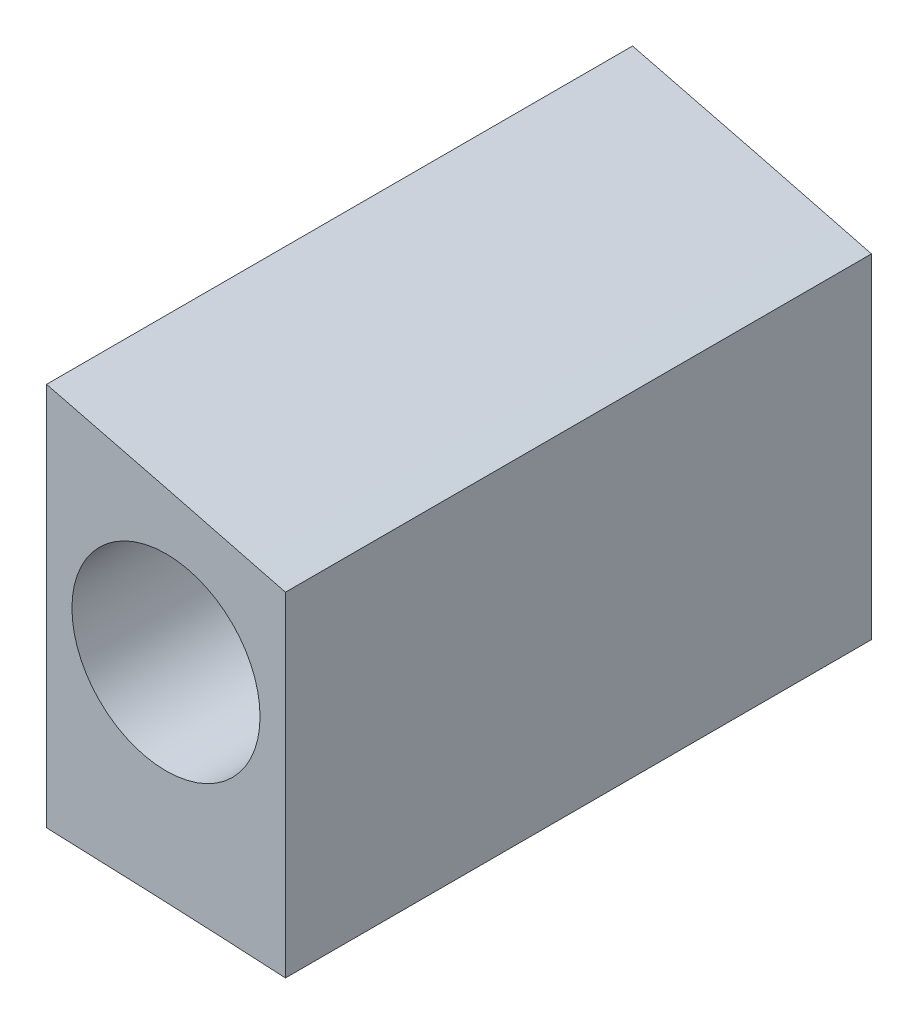
ISO-10303-21;
HEADER;
FILE_DESCRIPTION(('STEP AP214'),'2;1');
FILE_NAME('part.step','',(''),(''),'','','');
FILE_SCHEMA(('AUTOMOTIVE_DESIGN { 1 0 10303 214 1 1 1 1 }'));
ENDSEC;
DATA;
#1=APPLICATION_CONTEXT('core data for automotive mechanical design processes');
#2=APPLICATION_PROTOCOL_DEFINITION('international standard','automotive_design',2000,#1);
#3=PRODUCT_CONTEXT('',#1,'mechanical');
#4=PRODUCT('Part','Part','',(#3));
#5=PRODUCT_RELATED_PRODUCT_CATEGORY('part','',(#4));
#6=PRODUCT_DEFINITION_FORMATION('','',#4);
#7=PRODUCT_DEFINITION_CONTEXT('part definition',#1,'design');
#8=PRODUCT_DEFINITION('design','',#6,#7);
#9=PRODUCT_DEFINITION_SHAPE('','',#8);
#10=(LENGTH_UNIT() NAMED_UNIT(*) SI_UNIT(.MILLI.,.METRE.));
#11=(NAMED_UNIT(*) PLANE_ANGLE_UNIT() SI_UNIT($,.RADIAN.));
#12=(NAMED_UNIT(*) SI_UNIT($,.STERADIAN.) SOLID_ANGLE_UNIT());
#13=UNCERTAINTY_MEASURE_WITH_UNIT(LENGTH_MEASURE(1.E-05),#10,'distance_accuracy_value','');
#14=(GEOMETRIC_REPRESENTATION_CONTEXT(3) GLOBAL_UNCERTAINTY_ASSIGNED_CONTEXT((#13)) GLOBAL_UNIT_ASSIGNED_CONTEXT((#10,
#11,#12)) REPRESENTATION_CONTEXT('',''));
#15=CARTESIAN_POINT('',(0.,0.,0.));
#16=DIRECTION('',(0.,0.,1.));
#17=DIRECTION('',(1.,0.,0.));
#18=AXIS2_PLACEMENT_3D('',#15,#16,#17);
#19=CARTESIAN_POINT('',(0.000560351162113587,0.000130087070423624,31.1531));
#20=CARTESIAN_POINT('',(1.23071418869678,-6.92407609127206,31.1531));
#21=CARTESIAN_POINT('',(15.3166033306834,-6.18906584099094,31.1531));
#22=CARTESIAN_POINT('',(36.4546728163185,-6.09849990105009,31.1531));
#23=CARTESIAN_POINT('',(66.5061971849192,-0.586669106973501,31.1531));
#24=CARTESIAN_POINT('',(110.497331171581,6.18149522271792,31.1531));
#25=CARTESIAN_POINT('',(157.718638091679,9.03065014873911,31.1531));
#26=CARTESIAN_POINT('',(205.10142463584,8.83808028186313,31.1531));
#27=CARTESIAN_POINT('',(235.858814759408,7.87030619247826,31.1531));
#28=CARTESIAN_POINT('',(260.846344817159,5.42741339404395,31.1531));
#29=CARTESIAN_POINT('',(276.264022989737,4.51435670375389,31.1531));
#30=CARTESIAN_POINT('',(293.989507544058,2.09398731346533,31.1531));
#31=CARTESIAN_POINT('',(303.956832564589,1.47095520994628,31.1531));
#32=CARTESIAN_POINT('',(309.846313894505,0.000130087070423666,31.1531));
#33=B_SPLINE_CURVE_WITH_KNOTS('',3,(#19,#20,#21,#22,#23,#24,#25,#26,#27,#28,#29,#30,#31,#32),
.UNSPECIFIED.,.F.,.F.,(4,1,1,1,1,1,1,1,1,1,1,4),(0.,0.0569078595717698,0.106482711504673,
0.214488052979465,0.341297688349143,0.535095665520157,0.664680853556909,0.794660698192775,
0.828978881532905,0.904725108725214,0.942212919019968,1.),.UNSPECIFIED.);
#34=DIRECTION('',(0.,0.,-1.));
#35=VECTOR('',#34,1.);
#36=SURFACE_OF_LINEAR_EXTRUSION('',#33,#35);
#37=CARTESIAN_POINT('',(220.946313894505,8.25519881438191,31.1531));
#38=VERTEX_POINT('',#37);
#39=CARTESIAN_POINT('',(233.646313894505,7.69052977146896,31.1531));
#40=VERTEX_POINT('',#39);
#41=EDGE_CURVE('E87',#38,#40,#33,.T.);
#42=ORIENTED_EDGE('',*,*,#41,.F.);
#43=DIRECTION('',(0.,0.,-1.));
#44=VECTOR('',#43,1.);
#45=CARTESIAN_POINT('',(220.946313894505,8.25519881439546,31.1531));
#46=LINE('',#45,#44);
#47=CARTESIAN_POINT('',(220.946313894505,8.2551988143819,0.));
#48=VERTEX_POINT('',#47);
#49=EDGE_CURVE('E75',#38,#48,#46,.T.);
#50=ORIENTED_EDGE('',*,*,#49,.T.);
#51=CARTESIAN_POINT('',(0.000560351162113587,0.000130087070423624,0.));
#52=CARTESIAN_POINT('',(1.23071418869678,-6.92407609127206,0.));
#53=CARTESIAN_POINT('',(15.3166033306834,-6.18906584099094,0.));
#54=CARTESIAN_POINT('',(36.4546728163185,-6.09849990105009,0.));
#55=CARTESIAN_POINT('',(66.5061971849192,-0.586669106973501,0.));
#56=CARTESIAN_POINT('',(110.497331171581,6.18149522271792,0.));
#57=CARTESIAN_POINT('',(157.718638091679,9.03065014873911,0.));
#58=CARTESIAN_POINT('',(205.10142463584,8.83808028186313,0.));
#59=CARTESIAN_POINT('',(235.858814759408,7.87030619247826,0.));
#60=CARTESIAN_POINT('',(260.846344817159,5.42741339404395,0.));
#61=CARTESIAN_POINT('',(276.264022989737,4.51435670375389,0.));
#62=CARTESIAN_POINT('',(293.989507544058,2.09398731346533,0.));
#63=CARTESIAN_POINT('',(303.956832564589,1.47095520994628,0.));
#64=CARTESIAN_POINT('',(309.846313894505,0.000130087070423666,0.));
#65=B_SPLINE_CURVE_WITH_KNOTS('',3,(#51,#52,#53,#54,#55,#56,#57,#58,#59,#60,#61,#62,#63,#64),
.UNSPECIFIED.,.F.,.F.,(4,1,1,1,1,1,1,1,1,1,1,4),(0.,0.0569078595717698,0.106482711504673,
0.214488052979465,0.341297688349143,0.535095665520157,0.664680853556909,0.794660698192775,
0.828978881532905,0.904725108725214,0.942212919019968,1.),.UNSPECIFIED.);
#66=CARTESIAN_POINT('',(233.646313884782,7.69052977146896,0.));
#67=VERTEX_POINT('',#66);
#68=EDGE_CURVE('E58',#48,#67,#65,.T.);
#69=ORIENTED_EDGE('',*,*,#68,.T.);
#70=DIRECTION('',(0.,0.,-1.));
#71=VECTOR('',#70,1.);
#72=CARTESIAN_POINT('',(233.646313894505,7.69052977092525,31.1531));
#73=LINE('',#72,#71);
#74=EDGE_CURVE('E91',#40,#67,#73,.T.);
#75=ORIENTED_EDGE('',*,*,#74,.F.);
#76=EDGE_LOOP('',(#42,#50,#69,#75));
#77=FACE_BOUND('',#76,.T.);
#78=ADVANCED_FACE('F35',(#77),#36,.F.);
#79=CARTESIAN_POINT('',(309.846313894505,0.000130087070423864,31.1531));
#80=CARTESIAN_POINT('',(314.816918223261,-0.51620674157964,31.1531));
#81=CARTESIAN_POINT('',(301.273197720551,4.38282813873556,31.1531));
#82=CARTESIAN_POINT('',(290.359837670022,8.71099439045776,31.1531));
#83=CARTESIAN_POINT('',(256.952064400645,19.5289209482833,31.1531));
#84=CARTESIAN_POINT('',(217.961060472083,29.6129748944238,31.1531));
#85=CARTESIAN_POINT('',(173.256699242147,40.0411042779434,31.1531));
#86=CARTESIAN_POINT('',(131.400792108858,47.8848319151037,31.1531));
#87=CARTESIAN_POINT('',(89.5976184754884,49.290763053775,31.1531));
#88=CARTESIAN_POINT('',(52.1111282710831,42.0692152748914,31.1531));
#89=CARTESIAN_POINT('',(26.2867198183782,29.9751763284633,31.1531));
#90=CARTESIAN_POINT('',(8.64909202481883,17.8566051741579,31.1531));
#91=CARTESIAN_POINT('',(0.810633126632263,7.35919605469637,31.1531));
#92=CARTESIAN_POINT('',(0.000560351162116727,0.000130087070423829,31.1531));
#93=B_SPLINE_CURVE_WITH_KNOTS('',3,(#79,#80,#81,#82,#83,#84,#85,#86,#87,#88,#89,#90,#91,#92),
.UNSPECIFIED.,.F.,.F.,(4,1,1,1,1,1,1,1,1,1,1,4),(0.,0.0239417713693992,0.070244030177139,
0.147561721425381,0.308455887006792,0.442387865106874,0.551517565626309,0.687091076796298,
0.811391258419108,0.886311735305172,0.939136382225768,1.),.UNSPECIFIED.);
#94=DIRECTION('',(0.,0.,-1.));
#95=VECTOR('',#94,1.);
#96=SURFACE_OF_LINEAR_EXTRUSION('',#93,#95);
#97=CARTESIAN_POINT('',(309.846313894505,0.000130087070423864,0.));
#98=CARTESIAN_POINT('',(314.816918223261,-0.51620674157964,0.));
#99=CARTESIAN_POINT('',(301.273197720551,4.38282813873556,0.));
#100=CARTESIAN_POINT('',(290.359837670022,8.71099439045776,0.));
#101=CARTESIAN_POINT('',(256.952064400645,19.5289209482833,0.));
#102=CARTESIAN_POINT('',(217.961060472083,29.6129748944238,0.));
#103=CARTESIAN_POINT('',(173.256699242147,40.0411042779434,0.));
#104=CARTESIAN_POINT('',(131.400792108858,47.8848319151037,0.));
#105=CARTESIAN_POINT('',(89.5976184754884,49.290763053775,0.));
#106=CARTESIAN_POINT('',(52.1111282710831,42.0692152748914,0.));
#107=CARTESIAN_POINT('',(26.2867198183782,29.9751763284633,0.));
#108=CARTESIAN_POINT('',(8.64909202481883,17.8566051741579,0.));
#109=CARTESIAN_POINT('',(0.810633126632263,7.35919605469637,0.));
#110=CARTESIAN_POINT('',(0.000560351162116727,0.000130087070423829,0.));
#111=B_SPLINE_CURVE_WITH_KNOTS('',3,(#97,#98,#99,#100,#101,#102,#103,#104,#105,#106,#107,#108,
#109,#110),.UNSPECIFIED.,.F.,.F.,(4,1,1,1,1,1,1,1,1,1,1,4),(0.,0.0239417713693992,
0.070244030177139,0.147561721425381,0.308455887006792,0.442387865106874,0.551517565626309,
0.687091076796298,0.811391258419108,0.886311735305172,0.939136382225768,1.),.UNSPECIFIED.);
#112=CARTESIAN_POINT('',(233.646313894505,25.4527523915985,0.));
#113=VERTEX_POINT('',#112);
#114=CARTESIAN_POINT('',(220.946313894505,28.6725157585964,0.));
#115=VERTEX_POINT('',#114);
#116=EDGE_CURVE('E92',#113,#115,#111,.T.);
#117=ORIENTED_EDGE('',*,*,#116,.T.);
#118=DIRECTION('',(0.,0.,-1.));
#119=VECTOR('',#118,1.);
#120=CARTESIAN_POINT('',(220.946313894505,28.6725157585964,31.1531));
#121=LINE('',#120,#119);
#122=CARTESIAN_POINT('',(220.946313894505,28.6725157585964,31.1531));
#123=VERTEX_POINT('',#122);
#124=EDGE_CURVE('E50',#115,#123,#121,.F.);
#125=ORIENTED_EDGE('',*,*,#124,.T.);
#126=CARTESIAN_POINT('',(233.646313894505,25.4527523915985,31.1531));
#127=VERTEX_POINT('',#126);
#128=EDGE_CURVE('E43',#127,#123,#93,.T.);
#129=ORIENTED_EDGE('',*,*,#128,.F.);
#130=DIRECTION('',(0.,0.,-1.));
#131=VECTOR('',#130,1.);
#132=CARTESIAN_POINT('',(233.646313894505,25.4527523940641,31.1531));
#133=LINE('',#132,#131);
#134=EDGE_CURVE('E177',#113,#127,#133,.F.);
#135=ORIENTED_EDGE('',*,*,#134,.F.);
#136=EDGE_LOOP('',(#117,#125,#129,#135));
#137=FACE_BOUND('',#136,.T.);
#138=ADVANCED_FACE('F113',(#137),#96,.F.);
#139=CARTESIAN_POINT('',(153.387816973495,8.33338198857885,31.1531));
#140=DIRECTION('',(0.,0.,-1.));
#141=DIRECTION('',(-1.,0.,0.));
#142=AXIS2_PLACEMENT_3D('',#139,#140,#141);
#143=PLANE('',#142);
#144=CARTESIAN_POINT('',(227.296313894505,19.0501300870704,31.1531));
#145=DIRECTION('',(0.,0.,1.));
#146=DIRECTION('',(1.,0.,0.));
#147=AXIS2_PLACEMENT_3D('',#144,#145,#146);
#148=CIRCLE('',#147,4.99999999999999);
#149=CARTESIAN_POINT('',(232.296313894505,19.0501300870704,31.1531));
#150=VERTEX_POINT('',#149);
#151=EDGE_CURVE('E99',#150,#150,#148,.T.);
#152=ORIENTED_EDGE('',*,*,#151,.F.);
#153=EDGE_LOOP('',(#152));
#154=FACE_BOUND('',#153,.T.);
#155=ORIENTED_EDGE('',*,*,#128,.T.);
#156=DIRECTION('',(0.,1.,0.));
#157=VECTOR('',#156,1.);
#158=CARTESIAN_POINT('',(220.946313894505,-24.2165503945353,31.1531));
#159=LINE('',#158,#157);
#160=EDGE_CURVE('E78',#38,#123,#159,.T.);
#161=ORIENTED_EDGE('',*,*,#160,.F.);
#162=ORIENTED_EDGE('',*,*,#41,.T.);
#163=DIRECTION('',(0.,1.,0.));
#164=VECTOR('',#163,1.);
#165=CARTESIAN_POINT('',(233.646313894505,-6.34986991292955,31.1531));
#166=LINE('',#165,#164);
#167=EDGE_CURVE('E81',#40,#127,#166,.T.);
#168=ORIENTED_EDGE('',*,*,#167,.T.);
#169=EDGE_LOOP('',(#155,#161,#162,#168));
#170=FACE_BOUND('',#169,.T.);
#171=ADVANCED_FACE('F85',(#154,#170),#143,.F.);
#172=CARTESIAN_POINT('',(153.387816973495,8.33338198857885,0.));
#173=DIRECTION('',(0.,0.,-1.));
#174=DIRECTION('',(-1.,0.,0.));
#175=AXIS2_PLACEMENT_3D('',#172,#173,#174);
#176=PLANE('',#175);
#177=DIRECTION('',(0.,1.,0.));
#178=VECTOR('',#177,1.);
#179=CARTESIAN_POINT('',(220.946313894505,-24.2165503945353,0.));
#180=LINE('',#179,#178);
#181=EDGE_CURVE('E79',#48,#115,#180,.T.);
#182=ORIENTED_EDGE('',*,*,#181,.T.);
#183=ORIENTED_EDGE('',*,*,#116,.F.);
#184=DIRECTION('',(0.,-1.,0.));
#185=VECTOR('',#184,1.);
#186=CARTESIAN_POINT('',(233.646313894505,8.33338198857885,0.));
#187=LINE('',#186,#185);
#188=EDGE_CURVE('E11',#113,#67,#187,.T.);
#189=ORIENTED_EDGE('',*,*,#188,.T.);
#190=ORIENTED_EDGE('',*,*,#68,.F.);
#191=EDGE_LOOP('',(#182,#183,#189,#190));
#192=FACE_BOUND('',#191,.T.);
#193=CARTESIAN_POINT('',(227.296313894505,19.0501300870704,0.));
#194=DIRECTION('',(0.,0.,1.));
#195=DIRECTION('',(1.,0.,0.));
#196=AXIS2_PLACEMENT_3D('',#193,#194,#195);
#197=CIRCLE('',#196,4.99999999999999);
#198=CARTESIAN_POINT('',(232.296313894505,19.0501300870704,0.));
#199=VERTEX_POINT('',#198);
#200=EDGE_CURVE('E183',#199,#199,#197,.T.);
#201=ORIENTED_EDGE('',*,*,#200,.T.);
#202=EDGE_LOOP('',(#201));
#203=FACE_BOUND('',#202,.T.);
#204=ADVANCED_FACE('F117',(#192,#203),#176,.T.);
#205=CARTESIAN_POINT('',(227.296313894505,19.0501300870704,0.));
#206=DIRECTION('',(0.,0.,1.));
#207=DIRECTION('',(1.,0.,0.));
#208=AXIS2_PLACEMENT_3D('',#205,#206,#207);
#209=CYLINDRICAL_SURFACE('',#208,4.99999999999999);
#210=ORIENTED_EDGE('',*,*,#200,.F.);
#211=EDGE_LOOP('',(#210));
#212=FACE_BOUND('',#211,.T.);
#213=ORIENTED_EDGE('',*,*,#151,.T.);
#214=EDGE_LOOP('',(#213));
#215=FACE_BOUND('',#214,.T.);
#216=ADVANCED_FACE('F120',(#212,#215),#209,.F.);
#217=CARTESIAN_POINT('',(233.646313894505,-6.34986991292955,0.));
#218=DIRECTION('',(1.,0.,0.));
#219=DIRECTION('',(0.,0.,-1.));
#220=AXIS2_PLACEMENT_3D('',#217,#218,#219);
#221=PLANE('',#220);
#222=ORIENTED_EDGE('',*,*,#74,.T.);
#223=ORIENTED_EDGE('',*,*,#188,.F.);
#224=ORIENTED_EDGE('',*,*,#134,.T.);
#225=ORIENTED_EDGE('',*,*,#167,.F.);
#226=EDGE_LOOP('',(#222,#223,#224,#225));
#227=FACE_BOUND('',#226,.T.);
#228=ADVANCED_FACE('F127',(#227),#221,.T.);
#229=CARTESIAN_POINT('',(220.946313894505,-24.2165503945353,0.));
#230=DIRECTION('',(1.,0.,0.));
#231=DIRECTION('',(0.,1.,0.));
#232=AXIS2_PLACEMENT_3D('',#229,#230,#231);
#233=PLANE('',#232);
#234=ORIENTED_EDGE('',*,*,#160,.T.);
#235=ORIENTED_EDGE('',*,*,#124,.F.);
#236=ORIENTED_EDGE('',*,*,#181,.F.);
#237=ORIENTED_EDGE('',*,*,#49,.F.);
#238=EDGE_LOOP('',(#234,#235,#236,#237));
#239=FACE_BOUND('',#238,.T.);
#240=ADVANCED_FACE('F77',(#239),#233,.F.);
#241=CLOSED_SHELL('',(#78,#138,#171,#204,#216,#228,#240));
#242=MANIFOLD_SOLID_BREP('B2',#241);
#243=ADVANCED_BREP_SHAPE_REPRESENTATION('',(#18,#242),#14);
#244=SHAPE_DEFINITION_REPRESENTATION(#9,#243);
ENDSEC;
END-ISO-10303-21;
